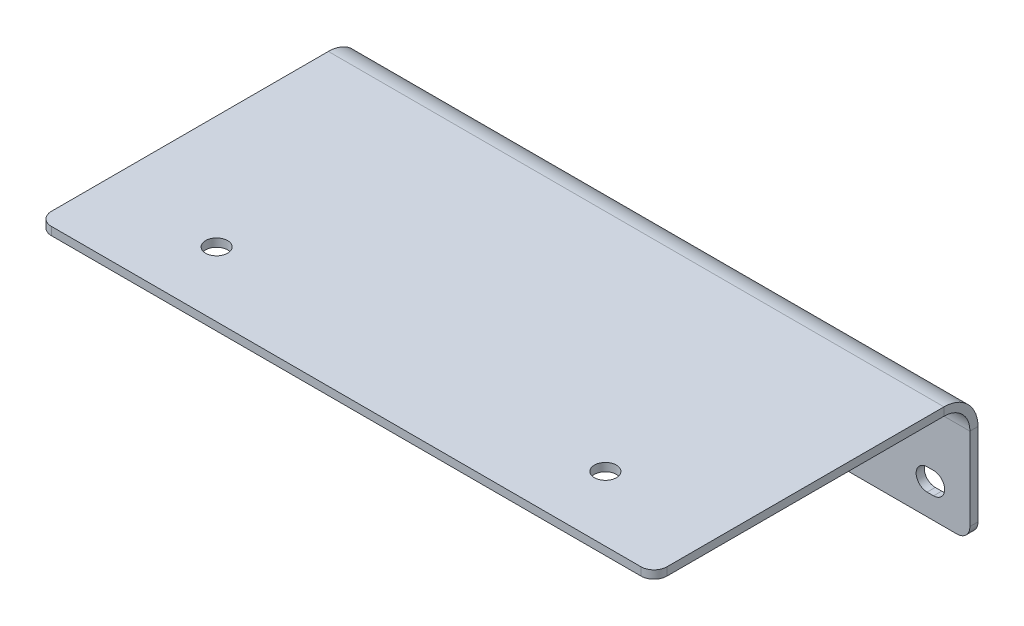
ISO-10303-21;
HEADER;
FILE_DESCRIPTION(('STEP AP214'),'2;1');
FILE_NAME('part.step','',(''),(''),'','','');
FILE_SCHEMA(('AUTOMOTIVE_DESIGN { 1 0 10303 214 1 1 1 1 }'));
ENDSEC;
DATA;
#1=APPLICATION_CONTEXT('core data for automotive mechanical design processes');
#2=APPLICATION_PROTOCOL_DEFINITION('international standard','automotive_design',2000,#1);
#3=PRODUCT_CONTEXT('',#1,'mechanical');
#4=PRODUCT('Part','Part','',(#3));
#5=PRODUCT_RELATED_PRODUCT_CATEGORY('part','',(#4));
#6=PRODUCT_DEFINITION_FORMATION('','',#4);
#7=PRODUCT_DEFINITION_CONTEXT('part definition',#1,'design');
#8=PRODUCT_DEFINITION('design','',#6,#7);
#9=PRODUCT_DEFINITION_SHAPE('','',#8);
#10=(LENGTH_UNIT() NAMED_UNIT(*) SI_UNIT(.MILLI.,.METRE.));
#11=(NAMED_UNIT(*) PLANE_ANGLE_UNIT() SI_UNIT($,.RADIAN.));
#12=(NAMED_UNIT(*) SI_UNIT($,.STERADIAN.) SOLID_ANGLE_UNIT());
#13=UNCERTAINTY_MEASURE_WITH_UNIT(LENGTH_MEASURE(1.E-05),#10,'distance_accuracy_value','');
#14=(GEOMETRIC_REPRESENTATION_CONTEXT(3) GLOBAL_UNCERTAINTY_ASSIGNED_CONTEXT((#13)) GLOBAL_UNIT_ASSIGNED_CONTEXT((#10,
#11,#12)) REPRESENTATION_CONTEXT('',''));
#15=CARTESIAN_POINT('',(0.,0.,0.));
#16=DIRECTION('',(0.,0.,1.));
#17=DIRECTION('',(1.,0.,0.));
#18=AXIS2_PLACEMENT_3D('',#15,#16,#17);
#19=CARTESIAN_POINT('',(0.,25.4,1.5875));
#20=DIRECTION('',(0.,0.,-1.));
#21=DIRECTION('',(-1.,0.,0.));
#22=AXIS2_PLACEMENT_3D('',#19,#20,#21);
#23=PLANE('',#22);
#24=DIRECTION('',(1.,0.,0.));
#25=VECTOR('',#24,1.);
#26=CARTESIAN_POINT('',(7.112,4.19734999999999,1.5875));
#27=LINE('',#26,#25);
#28=CARTESIAN_POINT('',(7.112,4.19734999999999,1.5875));
#29=VERTEX_POINT('',#28);
#30=CARTESIAN_POINT('',(8.382,4.19734999999999,1.5875));
#31=VERTEX_POINT('',#30);
#32=EDGE_CURVE('E231',#29,#31,#27,.T.);
#33=ORIENTED_EDGE('',*,*,#32,.F.);
#34=CARTESIAN_POINT('',(7.112,6.34999999999999,1.5875));
#35=DIRECTION('',(0.,0.,1.));
#36=DIRECTION('',(1.,0.,0.));
#37=AXIS2_PLACEMENT_3D('',#34,#35,#36);
#38=CIRCLE('',#37,2.15265);
#39=CARTESIAN_POINT('',(7.112,8.50264999999999,1.5875));
#40=VERTEX_POINT('',#39);
#41=EDGE_CURVE('E77',#40,#29,#38,.T.);
#42=ORIENTED_EDGE('',*,*,#41,.F.);
#43=DIRECTION('',(-1.,0.,0.));
#44=VECTOR('',#43,1.);
#45=CARTESIAN_POINT('',(7.112,8.50264999999999,1.5875));
#46=LINE('',#45,#44);
#47=CARTESIAN_POINT('',(8.382,8.50264999999999,1.5875));
#48=VERTEX_POINT('',#47);
#49=EDGE_CURVE('E219',#48,#40,#46,.T.);
#50=ORIENTED_EDGE('',*,*,#49,.F.);
#51=CARTESIAN_POINT('',(8.382,6.34999999999999,1.5875));
#52=DIRECTION('',(0.,0.,1.));
#53=DIRECTION('',(1.,0.,0.));
#54=AXIS2_PLACEMENT_3D('',#51,#52,#53);
#55=CIRCLE('',#54,2.15265);
#56=EDGE_CURVE('E222',#31,#48,#55,.T.);
#57=ORIENTED_EDGE('',*,*,#56,.F.);
#58=EDGE_LOOP('',(#33,#42,#50,#57));
#59=FACE_BOUND('',#58,.T.);
#60=DIRECTION('',(1.,0.,0.));
#61=VECTOR('',#60,1.);
#62=CARTESIAN_POINT('',(112.268,4.19735,1.5875));
#63=LINE('',#62,#61);
#64=CARTESIAN_POINT('',(112.268,4.19735,1.5875));
#65=VERTEX_POINT('',#64);
#66=CARTESIAN_POINT('',(113.538,4.19735,1.5875));
#67=VERTEX_POINT('',#66);
#68=EDGE_CURVE('E257',#65,#67,#63,.T.);
#69=ORIENTED_EDGE('',*,*,#68,.F.);
#70=CARTESIAN_POINT('',(112.268,6.35,1.5875));
#71=DIRECTION('',(0.,0.,1.));
#72=DIRECTION('',(1.,0.,0.));
#73=AXIS2_PLACEMENT_3D('',#70,#71,#72);
#74=CIRCLE('',#73,2.15265);
#75=CARTESIAN_POINT('',(112.268,8.50265,1.5875));
#76=VERTEX_POINT('',#75);
#77=EDGE_CURVE('E85',#76,#65,#74,.T.);
#78=ORIENTED_EDGE('',*,*,#77,.F.);
#79=DIRECTION('',(-1.,0.,0.));
#80=VECTOR('',#79,1.);
#81=CARTESIAN_POINT('',(112.268,8.50265,1.5875));
#82=LINE('',#81,#80);
#83=CARTESIAN_POINT('',(113.538,8.50265,1.5875));
#84=VERTEX_POINT('',#83);
#85=EDGE_CURVE('E246',#84,#76,#82,.T.);
#86=ORIENTED_EDGE('',*,*,#85,.F.);
#87=CARTESIAN_POINT('',(113.538,6.35,1.5875));
#88=DIRECTION('',(0.,0.,1.));
#89=DIRECTION('',(1.,0.,0.));
#90=AXIS2_PLACEMENT_3D('',#87,#88,#89);
#91=CIRCLE('',#90,2.15265);
#92=EDGE_CURVE('E261',#67,#84,#91,.T.);
#93=ORIENTED_EDGE('',*,*,#92,.F.);
#94=EDGE_LOOP('',(#69,#78,#86,#93));
#95=FACE_BOUND('',#94,.T.);
#96=DIRECTION('',(0.,-1.,0.));
#97=VECTOR('',#96,1.);
#98=CARTESIAN_POINT('',(0.,25.4,1.5875));
#99=LINE('',#98,#97);
#100=CARTESIAN_POINT('',(0.,18.7325,1.5875));
#101=VERTEX_POINT('',#100);
#102=CARTESIAN_POINT('',(0.,2.54,1.5875));
#103=VERTEX_POINT('',#102);
#104=EDGE_CURVE('E327',#101,#103,#99,.T.);
#105=ORIENTED_EDGE('',*,*,#104,.T.);
#106=CARTESIAN_POINT('',(2.54,2.54,1.5875));
#107=DIRECTION('',(0.,0.,-1.));
#108=DIRECTION('',(-1.,0.,0.));
#109=AXIS2_PLACEMENT_3D('',#106,#107,#108);
#110=CIRCLE('',#109,2.54);
#111=CARTESIAN_POINT('',(2.54,0.,1.5875));
#112=VERTEX_POINT('',#111);
#113=EDGE_CURVE('E353',#103,#112,#110,.F.);
#114=ORIENTED_EDGE('',*,*,#113,.T.);
#115=DIRECTION('',(1.,0.,0.));
#116=VECTOR('',#115,1.);
#117=CARTESIAN_POINT('',(0.,0.,1.5875));
#118=LINE('',#117,#116);
#119=CARTESIAN_POINT('',(118.11,0.,1.5875));
#120=VERTEX_POINT('',#119);
#121=EDGE_CURVE('E319',#112,#120,#118,.T.);
#122=ORIENTED_EDGE('',*,*,#121,.T.);
#123=CARTESIAN_POINT('',(118.11,2.54,1.5875));
#124=DIRECTION('',(0.,0.,-1.));
#125=DIRECTION('',(-1.,0.,0.));
#126=AXIS2_PLACEMENT_3D('',#123,#124,#125);
#127=CIRCLE('',#126,2.54);
#128=CARTESIAN_POINT('',(120.65,2.54,1.5875));
#129=VERTEX_POINT('',#128);
#130=EDGE_CURVE('E351',#120,#129,#127,.F.);
#131=ORIENTED_EDGE('',*,*,#130,.T.);
#132=DIRECTION('',(0.,-1.,0.));
#133=VECTOR('',#132,1.);
#134=CARTESIAN_POINT('',(120.65,25.4,1.5875));
#135=LINE('',#134,#133);
#136=CARTESIAN_POINT('',(120.65,18.7325,1.5875));
#137=VERTEX_POINT('',#136);
#138=EDGE_CURVE('E336',#137,#129,#135,.T.);
#139=ORIENTED_EDGE('',*,*,#138,.F.);
#140=DIRECTION('',(-1.,0.,0.));
#141=VECTOR('',#140,1.);
#142=CARTESIAN_POINT('',(0.,18.7325,1.5875));
#143=LINE('',#142,#141);
#144=EDGE_CURVE('E312',#101,#137,#143,.F.);
#145=ORIENTED_EDGE('',*,*,#144,.F.);
#146=EDGE_LOOP('',(#105,#114,#122,#131,#139,#145));
#147=FACE_BOUND('',#146,.T.);
#148=ADVANCED_FACE('F62',(#59,#95,#147),#23,.F.);
#149=CARTESIAN_POINT('',(0.,25.4,0.));
#150=DIRECTION('',(0.,0.,-1.));
#151=DIRECTION('',(-1.,0.,0.));
#152=AXIS2_PLACEMENT_3D('',#149,#150,#151);
#153=PLANE('',#152);
#154=CARTESIAN_POINT('',(7.112,6.34999999999999,0.));
#155=DIRECTION('',(0.,0.,1.));
#156=DIRECTION('',(1.,0.,0.));
#157=AXIS2_PLACEMENT_3D('',#154,#155,#156);
#158=CIRCLE('',#157,2.15265);
#159=CARTESIAN_POINT('',(7.112,8.50264999999999,0.));
#160=VERTEX_POINT('',#159);
#161=CARTESIAN_POINT('',(7.112,4.19734999999999,0.));
#162=VERTEX_POINT('',#161);
#163=EDGE_CURVE('E200',#160,#162,#158,.T.);
#164=ORIENTED_EDGE('',*,*,#163,.T.);
#165=DIRECTION('',(1.,0.,0.));
#166=VECTOR('',#165,1.);
#167=CARTESIAN_POINT('',(7.112,4.19734999999999,0.));
#168=LINE('',#167,#166);
#169=CARTESIAN_POINT('',(8.382,4.19734999999999,0.));
#170=VERTEX_POINT('',#169);
#171=EDGE_CURVE('E210',#162,#170,#168,.T.);
#172=ORIENTED_EDGE('',*,*,#171,.T.);
#173=CARTESIAN_POINT('',(8.382,6.34999999999999,0.));
#174=DIRECTION('',(0.,0.,1.));
#175=DIRECTION('',(1.,0.,0.));
#176=AXIS2_PLACEMENT_3D('',#173,#174,#175);
#177=CIRCLE('',#176,2.15265);
#178=CARTESIAN_POINT('',(8.382,8.50264999999999,0.));
#179=VERTEX_POINT('',#178);
#180=EDGE_CURVE('E214',#170,#179,#177,.T.);
#181=ORIENTED_EDGE('',*,*,#180,.T.);
#182=DIRECTION('',(-1.,0.,0.));
#183=VECTOR('',#182,1.);
#184=CARTESIAN_POINT('',(7.112,8.50264999999999,0.));
#185=LINE('',#184,#183);
#186=EDGE_CURVE('E206',#179,#160,#185,.T.);
#187=ORIENTED_EDGE('',*,*,#186,.T.);
#188=EDGE_LOOP('',(#164,#172,#181,#187));
#189=FACE_BOUND('',#188,.T.);
#190=CARTESIAN_POINT('',(112.268,6.35,0.));
#191=DIRECTION('',(0.,0.,1.));
#192=DIRECTION('',(1.,0.,0.));
#193=AXIS2_PLACEMENT_3D('',#190,#191,#192);
#194=CIRCLE('',#193,2.15265);
#195=CARTESIAN_POINT('',(112.268,8.50265,0.));
#196=VERTEX_POINT('',#195);
#197=CARTESIAN_POINT('',(112.268,4.19735,0.));
#198=VERTEX_POINT('',#197);
#199=EDGE_CURVE('E242',#196,#198,#194,.T.);
#200=ORIENTED_EDGE('',*,*,#199,.T.);
#201=DIRECTION('',(1.,0.,0.));
#202=VECTOR('',#201,1.);
#203=CARTESIAN_POINT('',(112.268,4.19735,0.));
#204=LINE('',#203,#202);
#205=CARTESIAN_POINT('',(113.538,4.19735,0.));
#206=VERTEX_POINT('',#205);
#207=EDGE_CURVE('E245',#198,#206,#204,.T.);
#208=ORIENTED_EDGE('',*,*,#207,.T.);
#209=CARTESIAN_POINT('',(113.538,6.35,0.));
#210=DIRECTION('',(0.,0.,1.));
#211=DIRECTION('',(1.,0.,0.));
#212=AXIS2_PLACEMENT_3D('',#209,#210,#211);
#213=CIRCLE('',#212,2.15265);
#214=CARTESIAN_POINT('',(113.538,8.50265,0.));
#215=VERTEX_POINT('',#214);
#216=EDGE_CURVE('E249',#206,#215,#213,.T.);
#217=ORIENTED_EDGE('',*,*,#216,.T.);
#218=DIRECTION('',(-1.,0.,0.));
#219=VECTOR('',#218,1.);
#220=CARTESIAN_POINT('',(112.268,8.50265,0.));
#221=LINE('',#220,#219);
#222=EDGE_CURVE('E252',#215,#196,#221,.T.);
#223=ORIENTED_EDGE('',*,*,#222,.T.);
#224=EDGE_LOOP('',(#200,#208,#217,#223));
#225=FACE_BOUND('',#224,.T.);
#226=DIRECTION('',(1.,0.,0.));
#227=VECTOR('',#226,1.);
#228=CARTESIAN_POINT('',(0.,0.,0.));
#229=LINE('',#228,#227);
#230=CARTESIAN_POINT('',(2.54,0.,0.));
#231=VERTEX_POINT('',#230);
#232=CARTESIAN_POINT('',(118.11,0.,0.));
#233=VERTEX_POINT('',#232);
#234=EDGE_CURVE('E324',#231,#233,#229,.T.);
#235=ORIENTED_EDGE('',*,*,#234,.F.);
#236=CARTESIAN_POINT('',(2.54,2.54,0.));
#237=DIRECTION('',(0.,0.,-1.));
#238=DIRECTION('',(-1.,0.,0.));
#239=AXIS2_PLACEMENT_3D('',#236,#237,#238);
#240=CIRCLE('',#239,2.54);
#241=CARTESIAN_POINT('',(0.,2.54,0.));
#242=VERTEX_POINT('',#241);
#243=EDGE_CURVE('E347',#231,#242,#240,.T.);
#244=ORIENTED_EDGE('',*,*,#243,.T.);
#245=DIRECTION('',(0.,-1.,0.));
#246=VECTOR('',#245,1.);
#247=CARTESIAN_POINT('',(0.,25.4,0.));
#248=LINE('',#247,#246);
#249=CARTESIAN_POINT('',(0.,18.7325,0.));
#250=VERTEX_POINT('',#249);
#251=EDGE_CURVE('E330',#250,#242,#248,.T.);
#252=ORIENTED_EDGE('',*,*,#251,.F.);
#253=DIRECTION('',(-1.,0.,0.));
#254=VECTOR('',#253,1.);
#255=CARTESIAN_POINT('',(0.,18.7325,0.));
#256=LINE('',#255,#254);
#257=CARTESIAN_POINT('',(120.65,18.7325,0.));
#258=VERTEX_POINT('',#257);
#259=EDGE_CURVE('E299',#250,#258,#256,.F.);
#260=ORIENTED_EDGE('',*,*,#259,.T.);
#261=DIRECTION('',(0.,-1.,0.));
#262=VECTOR('',#261,1.);
#263=CARTESIAN_POINT('',(120.65,25.4,0.));
#264=LINE('',#263,#262);
#265=CARTESIAN_POINT('',(120.65,2.54,0.));
#266=VERTEX_POINT('',#265);
#267=EDGE_CURVE('E333',#258,#266,#264,.T.);
#268=ORIENTED_EDGE('',*,*,#267,.T.);
#269=CARTESIAN_POINT('',(118.11,2.54,0.));
#270=DIRECTION('',(0.,0.,-1.));
#271=DIRECTION('',(-1.,0.,0.));
#272=AXIS2_PLACEMENT_3D('',#269,#270,#271);
#273=CIRCLE('',#272,2.54);
#274=EDGE_CURVE('E345',#266,#233,#273,.T.);
#275=ORIENTED_EDGE('',*,*,#274,.T.);
#276=EDGE_LOOP('',(#235,#244,#252,#260,#268,#275));
#277=FACE_BOUND('',#276,.T.);
#278=ADVANCED_FACE('F216',(#189,#225,#277),#153,.T.);
#279=CARTESIAN_POINT('',(0.,25.4,1.5875));
#280=DIRECTION('',(-1.,0.,0.));
#281=DIRECTION('',(0.,0.,1.));
#282=AXIS2_PLACEMENT_3D('',#279,#280,#281);
#283=PLANE('',#282);
#284=ORIENTED_EDGE('',*,*,#251,.T.);
#285=DIRECTION('',(0.,0.,-1.));
#286=VECTOR('',#285,1.);
#287=CARTESIAN_POINT('',(0.,2.54,1.5875));
#288=LINE('',#287,#286);
#289=EDGE_CURVE('E349',#242,#103,#288,.F.);
#290=ORIENTED_EDGE('',*,*,#289,.T.);
#291=ORIENTED_EDGE('',*,*,#104,.F.);
#292=DIRECTION('',(0.,0.,-1.));
#293=VECTOR('',#292,1.);
#294=CARTESIAN_POINT('',(0.,18.7325,1.5875));
#295=LINE('',#294,#293);
#296=EDGE_CURVE('E306',#101,#250,#295,.T.);
#297=ORIENTED_EDGE('',*,*,#296,.T.);
#298=EDGE_LOOP('',(#284,#290,#291,#297));
#299=FACE_BOUND('',#298,.T.);
#300=ADVANCED_FACE('F429',(#299),#283,.T.);
#301=CARTESIAN_POINT('',(120.65,25.4,0.));
#302=DIRECTION('',(1.,0.,0.));
#303=DIRECTION('',(0.,0.,-1.));
#304=AXIS2_PLACEMENT_3D('',#301,#302,#303);
#305=PLANE('',#304);
#306=ORIENTED_EDGE('',*,*,#138,.T.);
#307=DIRECTION('',(0.,0.,1.));
#308=VECTOR('',#307,1.);
#309=CARTESIAN_POINT('',(120.65,2.54,0.));
#310=LINE('',#309,#308);
#311=EDGE_CURVE('E355',#129,#266,#310,.F.);
#312=ORIENTED_EDGE('',*,*,#311,.T.);
#313=ORIENTED_EDGE('',*,*,#267,.F.);
#314=DIRECTION('',(0.,0.,-1.));
#315=VECTOR('',#314,1.);
#316=CARTESIAN_POINT('',(120.65,18.7325,1.5875));
#317=LINE('',#316,#315);
#318=EDGE_CURVE('E316',#137,#258,#317,.T.);
#319=ORIENTED_EDGE('',*,*,#318,.F.);
#320=EDGE_LOOP('',(#306,#312,#313,#319));
#321=FACE_BOUND('',#320,.T.);
#322=ADVANCED_FACE('F415',(#321),#305,.T.);
#323=CARTESIAN_POINT('',(0.,0.,0.));
#324=DIRECTION('',(0.,-1.,0.));
#325=DIRECTION('',(-1.,0.,0.));
#326=AXIS2_PLACEMENT_3D('',#323,#324,#325);
#327=PLANE('',#326);
#328=ORIENTED_EDGE('',*,*,#121,.F.);
#329=DIRECTION('',(0.,0.,-1.));
#330=VECTOR('',#329,1.);
#331=CARTESIAN_POINT('',(2.54,0.,0.));
#332=LINE('',#331,#330);
#333=EDGE_CURVE('E342',#112,#231,#332,.T.);
#334=ORIENTED_EDGE('',*,*,#333,.T.);
#335=ORIENTED_EDGE('',*,*,#234,.T.);
#336=DIRECTION('',(0.,0.,1.));
#337=VECTOR('',#336,1.);
#338=CARTESIAN_POINT('',(118.11,0.,0.));
#339=LINE('',#338,#337);
#340=EDGE_CURVE('E339',#233,#120,#339,.T.);
#341=ORIENTED_EDGE('',*,*,#340,.T.);
#342=EDGE_LOOP('',(#328,#334,#335,#341));
#343=FACE_BOUND('',#342,.T.);
#344=ADVANCED_FACE('F422',(#343),#327,.T.);
#345=CARTESIAN_POINT('',(120.65,18.7325,6.6675));
#346=DIRECTION('',(1.,0.,0.));
#347=DIRECTION('',(0.,0.,-1.));
#348=AXIS2_PLACEMENT_3D('',#345,#346,#347);
#349=PLANE('',#348);
#350=DIRECTION('',(0.,-1.,0.));
#351=VECTOR('',#350,1.);
#352=CARTESIAN_POINT('',(120.65,25.4,6.66749999999997));
#353=LINE('',#352,#351);
#354=CARTESIAN_POINT('',(120.65,23.8125,6.66749999999998));
#355=VERTEX_POINT('',#354);
#356=CARTESIAN_POINT('',(120.65,25.4,6.66749999999997));
#357=VERTEX_POINT('',#356);
#358=EDGE_CURVE('E238',#355,#357,#353,.F.);
#359=ORIENTED_EDGE('',*,*,#358,.F.);
#360=CARTESIAN_POINT('',(120.65,18.7325,6.6675));
#361=DIRECTION('',(-1.,0.,0.));
#362=DIRECTION('',(0.,0.,1.));
#363=AXIS2_PLACEMENT_3D('',#360,#361,#362);
#364=CIRCLE('',#363,5.08);
#365=EDGE_CURVE('E309',#137,#355,#364,.F.);
#366=ORIENTED_EDGE('',*,*,#365,.F.);
#367=ORIENTED_EDGE('',*,*,#318,.T.);
#368=CARTESIAN_POINT('',(120.65,18.7325,6.6675));
#369=DIRECTION('',(-1.,0.,0.));
#370=DIRECTION('',(0.,0.,1.));
#371=AXIS2_PLACEMENT_3D('',#368,#369,#370);
#372=CIRCLE('',#371,6.6675);
#373=EDGE_CURVE('E302',#258,#357,#372,.F.);
#374=ORIENTED_EDGE('',*,*,#373,.T.);
#375=EDGE_LOOP('',(#359,#366,#367,#374));
#376=FACE_BOUND('',#375,.T.);
#377=ADVANCED_FACE('F405',(#376),#349,.T.);
#378=CARTESIAN_POINT('',(0.,18.7325,6.6675));
#379=DIRECTION('',(1.,0.,0.));
#380=DIRECTION('',(0.,0.,-1.));
#381=AXIS2_PLACEMENT_3D('',#378,#379,#380);
#382=PLANE('',#381);
#383=CARTESIAN_POINT('',(0.,18.7325,6.6675));
#384=DIRECTION('',(-1.,0.,0.));
#385=DIRECTION('',(0.,0.,1.));
#386=AXIS2_PLACEMENT_3D('',#383,#384,#385);
#387=CIRCLE('',#386,5.08);
#388=CARTESIAN_POINT('',(0.,23.8125,6.66749999999998));
#389=VERTEX_POINT('',#388);
#390=EDGE_CURVE('E274',#389,#101,#387,.T.);
#391=ORIENTED_EDGE('',*,*,#390,.F.);
#392=DIRECTION('',(0.,-1.,0.));
#393=VECTOR('',#392,1.);
#394=CARTESIAN_POINT('',(0.,23.8125,6.66749999999998));
#395=LINE('',#394,#393);
#396=CARTESIAN_POINT('',(0.,25.4,6.66749999999997));
#397=VERTEX_POINT('',#396);
#398=EDGE_CURVE('E292',#389,#397,#395,.F.);
#399=ORIENTED_EDGE('',*,*,#398,.T.);
#400=CARTESIAN_POINT('',(0.,18.7325,6.6675));
#401=DIRECTION('',(-1.,0.,0.));
#402=DIRECTION('',(0.,0.,1.));
#403=AXIS2_PLACEMENT_3D('',#400,#401,#402);
#404=CIRCLE('',#403,6.6675);
#405=EDGE_CURVE('E303',#397,#250,#404,.T.);
#406=ORIENTED_EDGE('',*,*,#405,.T.);
#407=ORIENTED_EDGE('',*,*,#296,.F.);
#408=EDGE_LOOP('',(#391,#399,#406,#407));
#409=FACE_BOUND('',#408,.T.);
#410=ADVANCED_FACE('F401',(#409),#382,.F.);
#411=CARTESIAN_POINT('',(0.,18.7325,6.6675));
#412=DIRECTION('',(-1.,0.,0.));
#413=DIRECTION('',(0.,1.,0.));
#414=AXIS2_PLACEMENT_3D('',#411,#412,#413);
#415=CYLINDRICAL_SURFACE('',#414,6.6675);
#416=ORIENTED_EDGE('',*,*,#259,.F.);
#417=ORIENTED_EDGE('',*,*,#405,.F.);
#418=DIRECTION('',(-1.,0.,0.));
#419=VECTOR('',#418,1.);
#420=CARTESIAN_POINT('',(120.65,25.4,6.66749999999997));
#421=LINE('',#420,#419);
#422=EDGE_CURVE('E289',#397,#357,#421,.F.);
#423=ORIENTED_EDGE('',*,*,#422,.T.);
#424=ORIENTED_EDGE('',*,*,#373,.F.);
#425=EDGE_LOOP('',(#416,#417,#423,#424));
#426=FACE_BOUND('',#425,.T.);
#427=ADVANCED_FACE('F403',(#426),#415,.T.);
#428=CARTESIAN_POINT('',(0.,18.7325,6.6675));
#429=DIRECTION('',(-1.,0.,0.));
#430=DIRECTION('',(0.,1.,0.));
#431=AXIS2_PLACEMENT_3D('',#428,#429,#430);
#432=CYLINDRICAL_SURFACE('',#431,5.08);
#433=ORIENTED_EDGE('',*,*,#144,.T.);
#434=ORIENTED_EDGE('',*,*,#365,.T.);
#435=DIRECTION('',(-1.,0.,0.));
#436=VECTOR('',#435,1.);
#437=CARTESIAN_POINT('',(120.65,23.8125,6.66749999999998));
#438=LINE('',#437,#436);
#439=EDGE_CURVE('E295',#355,#389,#438,.T.);
#440=ORIENTED_EDGE('',*,*,#439,.T.);
#441=ORIENTED_EDGE('',*,*,#390,.T.);
#442=EDGE_LOOP('',(#433,#434,#440,#441));
#443=FACE_BOUND('',#442,.T.);
#444=ADVANCED_FACE('F433',(#443),#432,.F.);
#445=CARTESIAN_POINT('',(0.,25.4000000000002,63.5));
#446=DIRECTION('',(1.,0.,0.));
#447=DIRECTION('',(0.,0.,-1.));
#448=AXIS2_PLACEMENT_3D('',#445,#446,#447);
#449=PLANE('',#448);
#450=DIRECTION('',(0.,0.,-1.));
#451=VECTOR('',#450,1.);
#452=CARTESIAN_POINT('',(0.,23.8125000000002,63.5));
#453=LINE('',#452,#451);
#454=CARTESIAN_POINT('',(0.,23.8125000000002,60.96));
#455=VERTEX_POINT('',#454);
#456=EDGE_CURVE('E286',#389,#455,#453,.F.);
#457=ORIENTED_EDGE('',*,*,#456,.T.);
#458=DIRECTION('',(0.,-1.,0.));
#459=VECTOR('',#458,1.);
#460=CARTESIAN_POINT('',(0.,25.4000000000002,60.96));
#461=LINE('',#460,#459);
#462=CARTESIAN_POINT('',(0.,25.4000000000002,60.96));
#463=VERTEX_POINT('',#462);
#464=EDGE_CURVE('E13',#455,#463,#461,.F.);
#465=ORIENTED_EDGE('',*,*,#464,.T.);
#466=DIRECTION('',(0.,0.,1.));
#467=VECTOR('',#466,1.);
#468=CARTESIAN_POINT('',(0.,25.4,0.));
#469=LINE('',#468,#467);
#470=EDGE_CURVE('E278',#397,#463,#469,.T.);
#471=ORIENTED_EDGE('',*,*,#470,.F.);
#472=ORIENTED_EDGE('',*,*,#398,.F.);
#473=EDGE_LOOP('',(#457,#465,#471,#472));
#474=FACE_BOUND('',#473,.T.);
#475=ADVANCED_FACE('F397',(#474),#449,.F.);
#476=CARTESIAN_POINT('',(120.65,25.4,1.58749999999999));
#477=DIRECTION('',(-1.,0.,0.));
#478=DIRECTION('',(0.,0.,1.));
#479=AXIS2_PLACEMENT_3D('',#476,#477,#478);
#480=PLANE('',#479);
#481=DIRECTION('',(0.,0.,-1.));
#482=VECTOR('',#481,1.);
#483=CARTESIAN_POINT('',(120.65,25.4,0.));
#484=LINE('',#483,#482);
#485=CARTESIAN_POINT('',(120.65,25.4000000000002,60.96));
#486=VERTEX_POINT('',#485);
#487=EDGE_CURVE('E272',#486,#357,#484,.T.);
#488=ORIENTED_EDGE('',*,*,#487,.F.);
#489=DIRECTION('',(0.,-1.,0.));
#490=VECTOR('',#489,1.);
#491=CARTESIAN_POINT('',(120.65,25.4000000000002,60.96));
#492=LINE('',#491,#490);
#493=CARTESIAN_POINT('',(120.65,23.8125000000002,60.96));
#494=VERTEX_POINT('',#493);
#495=EDGE_CURVE('E357',#486,#494,#492,.T.);
#496=ORIENTED_EDGE('',*,*,#495,.T.);
#497=DIRECTION('',(0.,0.,1.));
#498=VECTOR('',#497,1.);
#499=CARTESIAN_POINT('',(120.65,23.8125,1.5875));
#500=LINE('',#499,#498);
#501=EDGE_CURVE('E281',#494,#355,#500,.F.);
#502=ORIENTED_EDGE('',*,*,#501,.T.);
#503=ORIENTED_EDGE('',*,*,#358,.T.);
#504=EDGE_LOOP('',(#488,#496,#502,#503));
#505=FACE_BOUND('',#504,.T.);
#506=ADVANCED_FACE('F380',(#505),#480,.F.);
#507=CARTESIAN_POINT('',(0.,25.4,0.));
#508=DIRECTION('',(0.,-1.,0.));
#509=DIRECTION('',(0.,0.,-1.));
#510=AXIS2_PLACEMENT_3D('',#507,#508,#509);
#511=PLANE('',#510);
#512=CARTESIAN_POINT('',(22.225,25.4000000000004,50.8));
#513=DIRECTION('',(0.,-1.,0.));
#514=DIRECTION('',(0.,0.,-1.));
#515=AXIS2_PLACEMENT_3D('',#512,#513,#514);
#516=CIRCLE('',#515,2.15265);
#517=CARTESIAN_POINT('',(22.225,25.4000000000004,48.64735));
#518=VERTEX_POINT('',#517);
#519=EDGE_CURVE('E258',#518,#518,#516,.T.);
#520=ORIENTED_EDGE('',*,*,#519,.T.);
#521=EDGE_LOOP('',(#520));
#522=FACE_BOUND('',#521,.T.);
#523=CARTESIAN_POINT('',(98.425,25.4000000000004,50.8));
#524=DIRECTION('',(0.,-1.,0.));
#525=DIRECTION('',(0.,0.,-1.));
#526=AXIS2_PLACEMENT_3D('',#523,#524,#525);
#527=CIRCLE('',#526,2.15265000000001);
#528=CARTESIAN_POINT('',(98.425,25.4000000000004,48.64735));
#529=VERTEX_POINT('',#528);
#530=EDGE_CURVE('E730',#529,#529,#527,.T.);
#531=ORIENTED_EDGE('',*,*,#530,.T.);
#532=EDGE_LOOP('',(#531));
#533=FACE_BOUND('',#532,.T.);
#534=DIRECTION('',(1.,0.,0.));
#535=VECTOR('',#534,1.);
#536=CARTESIAN_POINT('',(0.,25.4000000000002,63.5));
#537=LINE('',#536,#535);
#538=CARTESIAN_POINT('',(2.54000000000003,25.4000000000002,63.5));
#539=VERTEX_POINT('',#538);
#540=CARTESIAN_POINT('',(118.11,25.4000000000002,63.5));
#541=VERTEX_POINT('',#540);
#542=EDGE_CURVE('E275',#539,#541,#537,.T.);
#543=ORIENTED_EDGE('',*,*,#542,.T.);
#544=CARTESIAN_POINT('',(118.11,25.4000000000002,60.96));
#545=DIRECTION('',(0.,-1.,0.));
#546=DIRECTION('',(0.,0.,-1.));
#547=AXIS2_PLACEMENT_3D('',#544,#545,#546);
#548=CIRCLE('',#547,2.54);
#549=EDGE_CURVE('E70',#541,#486,#548,.F.);
#550=ORIENTED_EDGE('',*,*,#549,.T.);
#551=ORIENTED_EDGE('',*,*,#487,.T.);
#552=ORIENTED_EDGE('',*,*,#422,.F.);
#553=ORIENTED_EDGE('',*,*,#470,.T.);
#554=CARTESIAN_POINT('',(2.54000000000003,25.4000000000002,60.96));
#555=DIRECTION('',(0.,-1.,0.));
#556=DIRECTION('',(0.,0.,-1.));
#557=AXIS2_PLACEMENT_3D('',#554,#555,#556);
#558=CIRCLE('',#557,2.54);
#559=EDGE_CURVE('E369',#463,#539,#558,.F.);
#560=ORIENTED_EDGE('',*,*,#559,.T.);
#561=EDGE_LOOP('',(#543,#550,#551,#552,#553,#560));
#562=FACE_BOUND('',#561,.T.);
#563=ADVANCED_FACE('F373',(#522,#533,#562),#511,.F.);
#564=CARTESIAN_POINT('',(0.,23.8125,0.));
#565=DIRECTION('',(0.,-1.,0.));
#566=DIRECTION('',(0.,0.,-1.));
#567=AXIS2_PLACEMENT_3D('',#564,#565,#566);
#568=PLANE('',#567);
#569=CARTESIAN_POINT('',(22.225,23.8125000000002,50.8));
#570=DIRECTION('',(0.,-1.,0.));
#571=DIRECTION('',(0.,0.,-1.));
#572=AXIS2_PLACEMENT_3D('',#569,#570,#571);
#573=CIRCLE('',#572,2.15265);
#574=CARTESIAN_POINT('',(22.225,23.8125000000002,48.64735));
#575=VERTEX_POINT('',#574);
#576=EDGE_CURVE('E729',#575,#575,#573,.T.);
#577=ORIENTED_EDGE('',*,*,#576,.F.);
#578=EDGE_LOOP('',(#577));
#579=FACE_BOUND('',#578,.T.);
#580=CARTESIAN_POINT('',(98.425,23.8125000000002,50.8));
#581=DIRECTION('',(0.,-1.,0.));
#582=DIRECTION('',(0.,0.,-1.));
#583=AXIS2_PLACEMENT_3D('',#580,#581,#582);
#584=CIRCLE('',#583,2.15265000000001);
#585=CARTESIAN_POINT('',(98.425,23.8125000000002,48.64735));
#586=VERTEX_POINT('',#585);
#587=EDGE_CURVE('E225',#586,#586,#584,.T.);
#588=ORIENTED_EDGE('',*,*,#587,.F.);
#589=EDGE_LOOP('',(#588));
#590=FACE_BOUND('',#589,.T.);
#591=ORIENTED_EDGE('',*,*,#501,.F.);
#592=CARTESIAN_POINT('',(118.11,23.8125000000002,60.96));
#593=DIRECTION('',(0.,-1.,0.));
#594=DIRECTION('',(0.,0.,-1.));
#595=AXIS2_PLACEMENT_3D('',#592,#593,#594);
#596=CIRCLE('',#595,2.54);
#597=CARTESIAN_POINT('',(118.11,23.8125000000002,63.5));
#598=VERTEX_POINT('',#597);
#599=EDGE_CURVE('E362',#494,#598,#596,.T.);
#600=ORIENTED_EDGE('',*,*,#599,.T.);
#601=DIRECTION('',(-1.,0.,0.));
#602=VECTOR('',#601,1.);
#603=CARTESIAN_POINT('',(120.65,23.8125000000002,63.5));
#604=LINE('',#603,#602);
#605=CARTESIAN_POINT('',(2.54000000000003,23.8125000000002,63.5));
#606=VERTEX_POINT('',#605);
#607=EDGE_CURVE('E283',#606,#598,#604,.F.);
#608=ORIENTED_EDGE('',*,*,#607,.F.);
#609=CARTESIAN_POINT('',(2.54000000000003,23.8125000000002,60.96));
#610=DIRECTION('',(0.,-1.,0.));
#611=DIRECTION('',(0.,0.,-1.));
#612=AXIS2_PLACEMENT_3D('',#609,#610,#611);
#613=CIRCLE('',#612,2.54);
#614=EDGE_CURVE('E360',#606,#455,#613,.T.);
#615=ORIENTED_EDGE('',*,*,#614,.T.);
#616=ORIENTED_EDGE('',*,*,#456,.F.);
#617=ORIENTED_EDGE('',*,*,#439,.F.);
#618=EDGE_LOOP('',(#591,#600,#608,#615,#616,#617));
#619=FACE_BOUND('',#618,.T.);
#620=ADVANCED_FACE('F386',(#579,#590,#619),#568,.T.);
#621=CARTESIAN_POINT('',(120.65,25.4000000000002,63.5));
#622=DIRECTION('',(0.,0.,-1.));
#623=DIRECTION('',(0.,1.,0.));
#624=AXIS2_PLACEMENT_3D('',#621,#622,#623);
#625=PLANE('',#624);
#626=ORIENTED_EDGE('',*,*,#607,.T.);
#627=DIRECTION('',(0.,-1.,0.));
#628=VECTOR('',#627,1.);
#629=CARTESIAN_POINT('',(118.11,25.4000000000002,63.5));
#630=LINE('',#629,#628);
#631=EDGE_CURVE('E367',#598,#541,#630,.F.);
#632=ORIENTED_EDGE('',*,*,#631,.T.);
#633=ORIENTED_EDGE('',*,*,#542,.F.);
#634=DIRECTION('',(0.,-1.,0.));
#635=VECTOR('',#634,1.);
#636=CARTESIAN_POINT('',(2.54000000000003,25.4000000000002,63.5));
#637=LINE('',#636,#635);
#638=EDGE_CURVE('E364',#539,#606,#637,.T.);
#639=ORIENTED_EDGE('',*,*,#638,.T.);
#640=EDGE_LOOP('',(#626,#632,#633,#639));
#641=FACE_BOUND('',#640,.T.);
#642=ADVANCED_FACE('F389',(#641),#625,.F.);
#643=CARTESIAN_POINT('',(2.54,2.54,0.));
#644=DIRECTION('',(0.,0.,-1.));
#645=DIRECTION('',(-1.,0.,0.));
#646=AXIS2_PLACEMENT_3D('',#643,#644,#645);
#647=CYLINDRICAL_SURFACE('',#646,2.54);
#648=ORIENTED_EDGE('',*,*,#113,.F.);
#649=ORIENTED_EDGE('',*,*,#289,.F.);
#650=ORIENTED_EDGE('',*,*,#243,.F.);
#651=ORIENTED_EDGE('',*,*,#333,.F.);
#652=EDGE_LOOP('',(#648,#649,#650,#651));
#653=FACE_BOUND('',#652,.T.);
#654=ADVANCED_FACE('F426',(#653),#647,.T.);
#655=CARTESIAN_POINT('',(118.11,2.54,0.));
#656=DIRECTION('',(0.,0.,1.));
#657=DIRECTION('',(1.,0.,0.));
#658=AXIS2_PLACEMENT_3D('',#655,#656,#657);
#659=CYLINDRICAL_SURFACE('',#658,2.54);
#660=ORIENTED_EDGE('',*,*,#274,.F.);
#661=ORIENTED_EDGE('',*,*,#311,.F.);
#662=ORIENTED_EDGE('',*,*,#130,.F.);
#663=ORIENTED_EDGE('',*,*,#340,.F.);
#664=EDGE_LOOP('',(#660,#661,#662,#663));
#665=FACE_BOUND('',#664,.T.);
#666=ADVANCED_FACE('F418',(#665),#659,.T.);
#667=CARTESIAN_POINT('',(118.11,25.4000000000002,60.96));
#668=DIRECTION('',(0.,-1.,0.));
#669=DIRECTION('',(0.,0.,-1.));
#670=AXIS2_PLACEMENT_3D('',#667,#668,#669);
#671=CYLINDRICAL_SURFACE('',#670,2.54);
#672=ORIENTED_EDGE('',*,*,#549,.F.);
#673=ORIENTED_EDGE('',*,*,#631,.F.);
#674=ORIENTED_EDGE('',*,*,#599,.F.);
#675=ORIENTED_EDGE('',*,*,#495,.F.);
#676=EDGE_LOOP('',(#672,#673,#674,#675));
#677=FACE_BOUND('',#676,.T.);
#678=ADVANCED_FACE('F383',(#677),#671,.T.);
#679=CARTESIAN_POINT('',(2.54000000000003,25.4000000000002,60.96));
#680=DIRECTION('',(0.,-1.,0.));
#681=DIRECTION('',(0.,0.,-1.));
#682=AXIS2_PLACEMENT_3D('',#679,#680,#681);
#683=CYLINDRICAL_SURFACE('',#682,2.54);
#684=ORIENTED_EDGE('',*,*,#559,.F.);
#685=ORIENTED_EDGE('',*,*,#464,.F.);
#686=ORIENTED_EDGE('',*,*,#614,.F.);
#687=ORIENTED_EDGE('',*,*,#638,.F.);
#688=EDGE_LOOP('',(#684,#685,#686,#687));
#689=FACE_BOUND('',#688,.T.);
#690=ADVANCED_FACE('F64',(#689),#683,.T.);
#691=CARTESIAN_POINT('',(112.268,6.35,0.));
#692=DIRECTION('',(0.,0.,1.));
#693=DIRECTION('',(1.,0.,0.));
#694=AXIS2_PLACEMENT_3D('',#691,#692,#693);
#695=CYLINDRICAL_SURFACE('',#694,2.15265);
#696=ORIENTED_EDGE('',*,*,#77,.T.);
#697=DIRECTION('',(0.,0.,1.));
#698=VECTOR('',#697,1.);
#699=CARTESIAN_POINT('',(112.268,4.19735,0.));
#700=LINE('',#699,#698);
#701=EDGE_CURVE('E255',#198,#65,#700,.T.);
#702=ORIENTED_EDGE('',*,*,#701,.F.);
#703=ORIENTED_EDGE('',*,*,#199,.F.);
#704=DIRECTION('',(0.,0.,1.));
#705=VECTOR('',#704,1.);
#706=CARTESIAN_POINT('',(112.268,8.50265,0.));
#707=LINE('',#706,#705);
#708=EDGE_CURVE('E232',#196,#76,#707,.T.);
#709=ORIENTED_EDGE('',*,*,#708,.T.);
#710=EDGE_LOOP('',(#696,#702,#703,#709));
#711=FACE_BOUND('',#710,.T.);
#712=ADVANCED_FACE('F452',(#711),#695,.F.);
#713=CARTESIAN_POINT('',(112.268,8.50265,0.));
#714=DIRECTION('',(0.,1.,0.));
#715=DIRECTION('',(0.,0.,1.));
#716=AXIS2_PLACEMENT_3D('',#713,#714,#715);
#717=PLANE('',#716);
#718=ORIENTED_EDGE('',*,*,#85,.T.);
#719=ORIENTED_EDGE('',*,*,#708,.F.);
#720=ORIENTED_EDGE('',*,*,#222,.F.);
#721=DIRECTION('',(0.,0.,1.));
#722=VECTOR('',#721,1.);
#723=CARTESIAN_POINT('',(113.538,8.50265,0.));
#724=LINE('',#723,#722);
#725=EDGE_CURVE('E267',#215,#84,#724,.T.);
#726=ORIENTED_EDGE('',*,*,#725,.T.);
#727=EDGE_LOOP('',(#718,#719,#720,#726));
#728=FACE_BOUND('',#727,.T.);
#729=ADVANCED_FACE('F456',(#728),#717,.F.);
#730=CARTESIAN_POINT('',(113.538,6.35,0.));
#731=DIRECTION('',(0.,0.,1.));
#732=DIRECTION('',(1.,0.,0.));
#733=AXIS2_PLACEMENT_3D('',#730,#731,#732);
#734=CYLINDRICAL_SURFACE('',#733,2.15265);
#735=ORIENTED_EDGE('',*,*,#92,.T.);
#736=ORIENTED_EDGE('',*,*,#725,.F.);
#737=ORIENTED_EDGE('',*,*,#216,.F.);
#738=DIRECTION('',(0.,0.,1.));
#739=VECTOR('',#738,1.);
#740=CARTESIAN_POINT('',(113.538,4.19735,0.));
#741=LINE('',#740,#739);
#742=EDGE_CURVE('E269',#206,#67,#741,.T.);
#743=ORIENTED_EDGE('',*,*,#742,.T.);
#744=EDGE_LOOP('',(#735,#736,#737,#743));
#745=FACE_BOUND('',#744,.T.);
#746=ADVANCED_FACE('F461',(#745),#734,.F.);
#747=CARTESIAN_POINT('',(112.268,4.19735,0.));
#748=DIRECTION('',(0.,-1.,0.));
#749=DIRECTION('',(0.,0.,-1.));
#750=AXIS2_PLACEMENT_3D('',#747,#748,#749);
#751=PLANE('',#750);
#752=ORIENTED_EDGE('',*,*,#68,.T.);
#753=ORIENTED_EDGE('',*,*,#742,.F.);
#754=ORIENTED_EDGE('',*,*,#207,.F.);
#755=ORIENTED_EDGE('',*,*,#701,.T.);
#756=EDGE_LOOP('',(#752,#753,#754,#755));
#757=FACE_BOUND('',#756,.T.);
#758=ADVANCED_FACE('F466',(#757),#751,.F.);
#759=CARTESIAN_POINT('',(7.112,6.34999999999999,0.));
#760=DIRECTION('',(0.,0.,1.));
#761=DIRECTION('',(1.,0.,0.));
#762=AXIS2_PLACEMENT_3D('',#759,#760,#761);
#763=CYLINDRICAL_SURFACE('',#762,2.15265);
#764=ORIENTED_EDGE('',*,*,#41,.T.);
#765=DIRECTION('',(0.,0.,1.));
#766=VECTOR('',#765,1.);
#767=CARTESIAN_POINT('',(7.112,4.19734999999999,0.));
#768=LINE('',#767,#766);
#769=EDGE_CURVE('E196',#162,#29,#768,.T.);
#770=ORIENTED_EDGE('',*,*,#769,.F.);
#771=ORIENTED_EDGE('',*,*,#163,.F.);
#772=DIRECTION('',(0.,0.,1.));
#773=VECTOR('',#772,1.);
#774=CARTESIAN_POINT('',(7.112,8.50264999999999,0.));
#775=LINE('',#774,#773);
#776=EDGE_CURVE('E236',#160,#40,#775,.T.);
#777=ORIENTED_EDGE('',*,*,#776,.T.);
#778=EDGE_LOOP('',(#764,#770,#771,#777));
#779=FACE_BOUND('',#778,.T.);
#780=ADVANCED_FACE('F198',(#779),#763,.F.);
#781=CARTESIAN_POINT('',(7.112,8.50264999999999,0.));
#782=DIRECTION('',(0.,1.,0.));
#783=DIRECTION('',(0.,0.,1.));
#784=AXIS2_PLACEMENT_3D('',#781,#782,#783);
#785=PLANE('',#784);
#786=ORIENTED_EDGE('',*,*,#49,.T.);
#787=ORIENTED_EDGE('',*,*,#776,.F.);
#788=ORIENTED_EDGE('',*,*,#186,.F.);
#789=DIRECTION('',(0.,0.,1.));
#790=VECTOR('',#789,1.);
#791=CARTESIAN_POINT('',(8.382,8.50264999999999,0.));
#792=LINE('',#791,#790);
#793=EDGE_CURVE('E239',#179,#48,#792,.T.);
#794=ORIENTED_EDGE('',*,*,#793,.T.);
#795=EDGE_LOOP('',(#786,#787,#788,#794));
#796=FACE_BOUND('',#795,.T.);
#797=ADVANCED_FACE('F605',(#796),#785,.F.);
#798=CARTESIAN_POINT('',(8.382,6.34999999999999,0.));
#799=DIRECTION('',(0.,0.,1.));
#800=DIRECTION('',(1.,0.,0.));
#801=AXIS2_PLACEMENT_3D('',#798,#799,#800);
#802=CYLINDRICAL_SURFACE('',#801,2.15265);
#803=ORIENTED_EDGE('',*,*,#56,.T.);
#804=ORIENTED_EDGE('',*,*,#793,.F.);
#805=ORIENTED_EDGE('',*,*,#180,.F.);
#806=DIRECTION('',(0.,0.,1.));
#807=VECTOR('',#806,1.);
#808=CARTESIAN_POINT('',(8.382,4.19734999999999,0.));
#809=LINE('',#808,#807);
#810=EDGE_CURVE('E205',#170,#31,#809,.T.);
#811=ORIENTED_EDGE('',*,*,#810,.T.);
#812=EDGE_LOOP('',(#803,#804,#805,#811));
#813=FACE_BOUND('',#812,.T.);
#814=ADVANCED_FACE('F615',(#813),#802,.F.);
#815=CARTESIAN_POINT('',(7.112,4.19734999999999,0.));
#816=DIRECTION('',(0.,-1.,0.));
#817=DIRECTION('',(0.,0.,-1.));
#818=AXIS2_PLACEMENT_3D('',#815,#816,#817);
#819=PLANE('',#818);
#820=ORIENTED_EDGE('',*,*,#32,.T.);
#821=ORIENTED_EDGE('',*,*,#810,.F.);
#822=ORIENTED_EDGE('',*,*,#171,.F.);
#823=ORIENTED_EDGE('',*,*,#769,.T.);
#824=EDGE_LOOP('',(#820,#821,#822,#823));
#825=FACE_BOUND('',#824,.T.);
#826=ADVANCED_FACE('F211',(#825),#819,.F.);
#827=CARTESIAN_POINT('',(98.425,25.4000000000004,50.8));
#828=DIRECTION('',(0.,-1.,0.));
#829=DIRECTION('',(0.,0.,-1.));
#830=AXIS2_PLACEMENT_3D('',#827,#828,#829);
#831=CYLINDRICAL_SURFACE('',#830,2.15265000000001);
#832=CARTESIAN_POINT('',(98.425,25.4000000000004,48.64735));
#833=CARTESIAN_POINT('',(98.425,25.383463541667,48.64735));
#834=CARTESIAN_POINT('',(98.425,25.3669270833337,48.64735));
#835=CARTESIAN_POINT('',(98.425,25.333854166667,48.64735));
#836=CARTESIAN_POINT('',(98.425,25.3173177083337,48.64735));
#837=CARTESIAN_POINT('',(98.425,25.284244791667,48.64735));
#838=CARTESIAN_POINT('',(98.425,25.2677083333337,48.64735));
#839=CARTESIAN_POINT('',(98.425,25.234635416667,48.64735));
#840=CARTESIAN_POINT('',(98.425,25.2180989583337,48.64735));
#841=CARTESIAN_POINT('',(98.425,25.185026041667,48.64735));
#842=CARTESIAN_POINT('',(98.425,25.1684895833337,48.64735));
#843=CARTESIAN_POINT('',(98.425,25.135416666667,48.64735));
#844=CARTESIAN_POINT('',(98.425,25.1188802083337,48.64735));
#845=CARTESIAN_POINT('',(98.425,25.085807291667,48.64735));
#846=CARTESIAN_POINT('',(98.425,25.0692708333337,48.64735));
#847=CARTESIAN_POINT('',(98.425,25.036197916667,48.64735));
#848=CARTESIAN_POINT('',(98.425,25.0196614583337,48.64735));
#849=CARTESIAN_POINT('',(98.425,24.986588541667,48.64735));
#850=CARTESIAN_POINT('',(98.425,24.9700520833337,48.64735));
#851=CARTESIAN_POINT('',(98.425,24.936979166667,48.64735));
#852=CARTESIAN_POINT('',(98.425,24.9204427083336,48.64735));
#853=CARTESIAN_POINT('',(98.425,24.887369791667,48.64735));
#854=CARTESIAN_POINT('',(98.425,24.8708333333336,48.64735));
#855=CARTESIAN_POINT('',(98.425,24.837760416667,48.64735));
#856=CARTESIAN_POINT('',(98.425,24.8212239583336,48.64735));
#857=CARTESIAN_POINT('',(98.425,24.788151041667,48.64735));
#858=CARTESIAN_POINT('',(98.425,24.7716145833336,48.64735));
#859=CARTESIAN_POINT('',(98.425,24.738541666667,48.64735));
#860=CARTESIAN_POINT('',(98.425,24.7220052083336,48.64735));
#861=CARTESIAN_POINT('',(98.425,24.688932291667,48.64735));
#862=CARTESIAN_POINT('',(98.425,24.6723958333336,48.64735));
#863=CARTESIAN_POINT('',(98.425,24.6393229166669,48.64735));
#864=CARTESIAN_POINT('',(98.425,24.6227864583336,48.64735));
#865=CARTESIAN_POINT('',(98.425,24.5897135416669,48.64735));
#866=CARTESIAN_POINT('',(98.425,24.5731770833336,48.64735));
#867=CARTESIAN_POINT('',(98.425,24.5401041666669,48.64735));
#868=CARTESIAN_POINT('',(98.425,24.5235677083336,48.64735));
#869=CARTESIAN_POINT('',(98.425,24.4904947916669,48.64735));
#870=CARTESIAN_POINT('',(98.425,24.4739583333336,48.64735));
#871=CARTESIAN_POINT('',(98.425,24.4408854166669,48.64735));
#872=CARTESIAN_POINT('',(98.425,24.4243489583336,48.64735));
#873=CARTESIAN_POINT('',(98.425,24.3912760416669,48.64735));
#874=CARTESIAN_POINT('',(98.425,24.3747395833336,48.64735));
#875=CARTESIAN_POINT('',(98.425,24.3416666666669,48.64735));
#876=CARTESIAN_POINT('',(98.425,24.3251302083336,48.64735));
#877=CARTESIAN_POINT('',(98.425,24.2920572916669,48.64735));
#878=CARTESIAN_POINT('',(98.425,24.2755208333336,48.64735));
#879=CARTESIAN_POINT('',(98.425,24.2424479166669,48.64735));
#880=CARTESIAN_POINT('',(98.425,24.2259114583336,48.64735));
#881=CARTESIAN_POINT('',(98.425,24.1928385416669,48.64735));
#882=CARTESIAN_POINT('',(98.425,24.1763020833335,48.64735));
#883=CARTESIAN_POINT('',(98.425,24.1432291666669,48.64735));
#884=CARTESIAN_POINT('',(98.425,24.1266927083335,48.64735));
#885=CARTESIAN_POINT('',(98.425,24.0936197916669,48.64735));
#886=CARTESIAN_POINT('',(98.425,24.0770833333335,48.64735));
#887=CARTESIAN_POINT('',(98.425,24.0440104166669,48.64735));
#888=CARTESIAN_POINT('',(98.425,24.0274739583335,48.64735));
#889=CARTESIAN_POINT('',(98.425,23.9944010416669,48.64735));
#890=CARTESIAN_POINT('',(98.425,23.9778645833335,48.64735));
#891=CARTESIAN_POINT('',(98.425,23.9447916666668,48.64735));
#892=CARTESIAN_POINT('',(98.425,23.9282552083335,48.64735));
#893=CARTESIAN_POINT('',(98.425,23.8951822916668,48.64735));
#894=CARTESIAN_POINT('',(98.425,23.8786458333335,48.64735));
#895=CARTESIAN_POINT('',(98.425,23.8455729166668,48.64735));
#896=CARTESIAN_POINT('',(98.425,23.8290364583335,48.64735));
#897=CARTESIAN_POINT('',(98.425,23.8125000000002,48.64735));
#898=B_SPLINE_CURVE_WITH_KNOTS('',3,(#832,#833,#834,#835,#836,#837,#838,#839,#840,#841,#842,
#843,#844,#845,#846,#847,#848,#849,#850,#851,#852,#853,#854,#855,#856,#857,#858,#859,#860,#861,
#862,#863,#864,#865,#866,#867,#868,#869,#870,#871,#872,#873,#874,#875,#876,#877,#878,#879,#880,
#881,#882,#883,#884,#885,#886,#887,#888,#889,#890,#891,#892,#893,#894,#895,#896,#897),
.UNSPECIFIED.,.F.,.F.,(4,2,2,2,2,2,2,2,2,2,2,2,2,2,2,2,2,2,2,2,2,2,2,2,2,2,2,2,2,2,2,2,4),(0.,
0.0496093750000058,0.0992187500000116,0.148828125000017,0.198437500000027,0.248046875000033,
0.297656250000038,0.347265625000048,0.396875000000053,0.446484375000059,0.496093750000069,
0.545703125000074,0.59531250000008,0.644921875000089,0.694531250000095,0.744140625000101,
0.793750000000107,0.843359375000116,0.892968750000122,0.942578125000128,0.992187500000137,
1.04179687500014,1.09140625000015,1.14101562500016,1.19062500000016,1.24023437500017,
1.28984375000018,1.33945312500018,1.38906250000019,1.4386718750002,1.48828125000021,
1.53789062500021,1.58750000000022),.UNSPECIFIED.);
#899=EDGE_CURVE('BSEAM634',#529,#586,#898,.T.);
#900=ORIENTED_EDGE('',*,*,#530,.F.);
#901=ORIENTED_EDGE('',*,*,#587,.T.);
#902=ORIENTED_EDGE('',*,*,#899,.T.);
#903=ORIENTED_EDGE('',*,*,#899,.F.);
#904=EDGE_LOOP('',(#900,#902,#901,#903));
#905=FACE_BOUND('',#904,.T.);
#906=ADVANCED_FACE('F634',(#905),#831,.F.);
#907=CARTESIAN_POINT('',(22.225,25.4000000000004,50.8));
#908=DIRECTION('',(0.,-1.,0.));
#909=DIRECTION('',(0.,0.,-1.));
#910=AXIS2_PLACEMENT_3D('',#907,#908,#909);
#911=CYLINDRICAL_SURFACE('',#910,2.15265);
#912=CARTESIAN_POINT('',(22.225,25.4000000000004,48.64735));
#913=CARTESIAN_POINT('',(22.225,25.383463541667,48.64735));
#914=CARTESIAN_POINT('',(22.225,25.3669270833337,48.64735));
#915=CARTESIAN_POINT('',(22.225,25.333854166667,48.64735));
#916=CARTESIAN_POINT('',(22.225,25.3173177083337,48.64735));
#917=CARTESIAN_POINT('',(22.225,25.284244791667,48.64735));
#918=CARTESIAN_POINT('',(22.225,25.2677083333337,48.64735));
#919=CARTESIAN_POINT('',(22.225,25.234635416667,48.64735));
#920=CARTESIAN_POINT('',(22.225,25.2180989583337,48.64735));
#921=CARTESIAN_POINT('',(22.225,25.185026041667,48.64735));
#922=CARTESIAN_POINT('',(22.225,25.1684895833337,48.64735));
#923=CARTESIAN_POINT('',(22.225,25.135416666667,48.64735));
#924=CARTESIAN_POINT('',(22.225,25.1188802083337,48.64735));
#925=CARTESIAN_POINT('',(22.225,25.085807291667,48.64735));
#926=CARTESIAN_POINT('',(22.225,25.0692708333337,48.64735));
#927=CARTESIAN_POINT('',(22.225,25.036197916667,48.64735));
#928=CARTESIAN_POINT('',(22.225,25.0196614583337,48.64735));
#929=CARTESIAN_POINT('',(22.225,24.986588541667,48.64735));
#930=CARTESIAN_POINT('',(22.225,24.9700520833337,48.64735));
#931=CARTESIAN_POINT('',(22.225,24.936979166667,48.64735));
#932=CARTESIAN_POINT('',(22.225,24.9204427083336,48.64735));
#933=CARTESIAN_POINT('',(22.225,24.887369791667,48.64735));
#934=CARTESIAN_POINT('',(22.225,24.8708333333336,48.64735));
#935=CARTESIAN_POINT('',(22.225,24.837760416667,48.64735));
#936=CARTESIAN_POINT('',(22.225,24.8212239583336,48.64735));
#937=CARTESIAN_POINT('',(22.225,24.788151041667,48.64735));
#938=CARTESIAN_POINT('',(22.225,24.7716145833336,48.64735));
#939=CARTESIAN_POINT('',(22.225,24.738541666667,48.64735));
#940=CARTESIAN_POINT('',(22.225,24.7220052083336,48.64735));
#941=CARTESIAN_POINT('',(22.225,24.688932291667,48.64735));
#942=CARTESIAN_POINT('',(22.225,24.6723958333336,48.64735));
#943=CARTESIAN_POINT('',(22.225,24.6393229166669,48.64735));
#944=CARTESIAN_POINT('',(22.225,24.6227864583336,48.64735));
#945=CARTESIAN_POINT('',(22.225,24.5897135416669,48.64735));
#946=CARTESIAN_POINT('',(22.225,24.5731770833336,48.64735));
#947=CARTESIAN_POINT('',(22.225,24.5401041666669,48.64735));
#948=CARTESIAN_POINT('',(22.225,24.5235677083336,48.64735));
#949=CARTESIAN_POINT('',(22.225,24.4904947916669,48.64735));
#950=CARTESIAN_POINT('',(22.225,24.4739583333336,48.64735));
#951=CARTESIAN_POINT('',(22.225,24.4408854166669,48.64735));
#952=CARTESIAN_POINT('',(22.225,24.4243489583336,48.64735));
#953=CARTESIAN_POINT('',(22.225,24.3912760416669,48.64735));
#954=CARTESIAN_POINT('',(22.225,24.3747395833336,48.64735));
#955=CARTESIAN_POINT('',(22.225,24.3416666666669,48.64735));
#956=CARTESIAN_POINT('',(22.225,24.3251302083336,48.64735));
#957=CARTESIAN_POINT('',(22.225,24.2920572916669,48.64735));
#958=CARTESIAN_POINT('',(22.225,24.2755208333336,48.64735));
#959=CARTESIAN_POINT('',(22.225,24.2424479166669,48.64735));
#960=CARTESIAN_POINT('',(22.225,24.2259114583336,48.64735));
#961=CARTESIAN_POINT('',(22.225,24.1928385416669,48.64735));
#962=CARTESIAN_POINT('',(22.225,24.1763020833335,48.64735));
#963=CARTESIAN_POINT('',(22.225,24.1432291666669,48.64735));
#964=CARTESIAN_POINT('',(22.225,24.1266927083335,48.64735));
#965=CARTESIAN_POINT('',(22.225,24.0936197916669,48.64735));
#966=CARTESIAN_POINT('',(22.225,24.0770833333335,48.64735));
#967=CARTESIAN_POINT('',(22.225,24.0440104166669,48.64735));
#968=CARTESIAN_POINT('',(22.225,24.0274739583335,48.64735));
#969=CARTESIAN_POINT('',(22.225,23.9944010416669,48.64735));
#970=CARTESIAN_POINT('',(22.225,23.9778645833335,48.64735));
#971=CARTESIAN_POINT('',(22.225,23.9447916666668,48.64735));
#972=CARTESIAN_POINT('',(22.225,23.9282552083335,48.64735));
#973=CARTESIAN_POINT('',(22.225,23.8951822916668,48.64735));
#974=CARTESIAN_POINT('',(22.225,23.8786458333335,48.64735));
#975=CARTESIAN_POINT('',(22.225,23.8455729166668,48.64735));
#976=CARTESIAN_POINT('',(22.225,23.8290364583335,48.64735));
#977=CARTESIAN_POINT('',(22.225,23.8125000000002,48.64735));
#978=B_SPLINE_CURVE_WITH_KNOTS('',3,(#912,#913,#914,#915,#916,#917,#918,#919,#920,#921,#922,
#923,#924,#925,#926,#927,#928,#929,#930,#931,#932,#933,#934,#935,#936,#937,#938,#939,#940,#941,
#942,#943,#944,#945,#946,#947,#948,#949,#950,#951,#952,#953,#954,#955,#956,#957,#958,#959,#960,
#961,#962,#963,#964,#965,#966,#967,#968,#969,#970,#971,#972,#973,#974,#975,#976,#977),
.UNSPECIFIED.,.F.,.F.,(4,2,2,2,2,2,2,2,2,2,2,2,2,2,2,2,2,2,2,2,2,2,2,2,2,2,2,2,2,2,2,2,4),(0.,
0.0496093750000058,0.0992187500000116,0.148828125000017,0.198437500000027,0.248046875000033,
0.297656250000038,0.347265625000048,0.396875000000053,0.446484375000059,0.496093750000069,
0.545703125000074,0.59531250000008,0.644921875000089,0.694531250000095,0.744140625000101,
0.793750000000107,0.843359375000116,0.892968750000122,0.942578125000128,0.992187500000137,
1.04179687500014,1.09140625000015,1.14101562500016,1.19062500000016,1.24023437500017,
1.28984375000018,1.33945312500018,1.38906250000019,1.4386718750002,1.48828125000021,
1.53789062500021,1.58750000000022),.UNSPECIFIED.);
#979=EDGE_CURVE('BSEAM644',#518,#575,#978,.T.);
#980=ORIENTED_EDGE('',*,*,#519,.F.);
#981=ORIENTED_EDGE('',*,*,#576,.T.);
#982=ORIENTED_EDGE('',*,*,#979,.T.);
#983=ORIENTED_EDGE('',*,*,#979,.F.);
#984=EDGE_LOOP('',(#980,#982,#981,#983));
#985=FACE_BOUND('',#984,.T.);
#986=ADVANCED_FACE('F644',(#985),#911,.F.);
#987=CLOSED_SHELL('',(#148,#278,#300,#322,#344,#377,#410,#427,#444,#475,#506,#563,#620,#642,
#654,#666,#678,#690,#712,#729,#746,#758,#780,#797,#814,#826,#906,#986));
#988=MANIFOLD_SOLID_BREP('B2',#987);
#989=ADVANCED_BREP_SHAPE_REPRESENTATION('',(#18,#988),#14);
#990=SHAPE_DEFINITION_REPRESENTATION(#9,#989);
ENDSEC;
END-ISO-10303-21;
